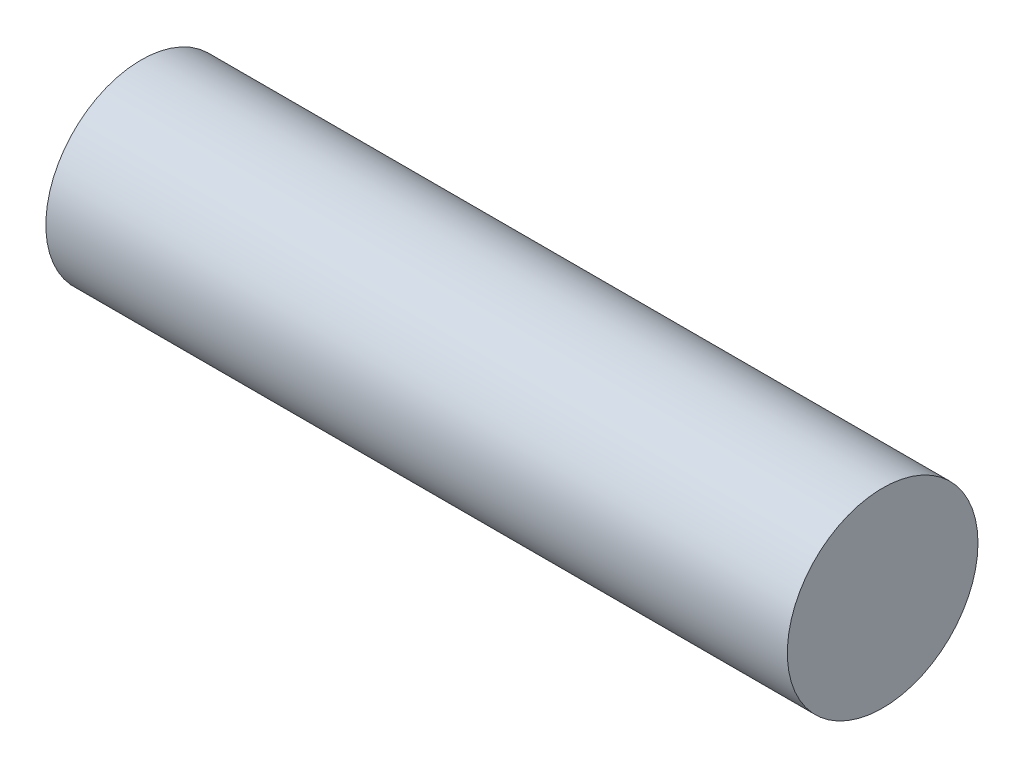
ISO-10303-21;
HEADER;
FILE_DESCRIPTION(('STEP AP214'),'2;1');
FILE_NAME('part.step','',(''),(''),'','','');
FILE_SCHEMA(('AUTOMOTIVE_DESIGN { 1 0 10303 214 1 1 1 1 }'));
ENDSEC;
DATA;
#1=APPLICATION_CONTEXT('core data for automotive mechanical design processes');
#2=APPLICATION_PROTOCOL_DEFINITION('international standard','automotive_design',2000,#1);
#3=PRODUCT_CONTEXT('',#1,'mechanical');
#4=PRODUCT('Part','Part','',(#3));
#5=PRODUCT_RELATED_PRODUCT_CATEGORY('part','',(#4));
#6=PRODUCT_DEFINITION_FORMATION('','',#4);
#7=PRODUCT_DEFINITION_CONTEXT('part definition',#1,'design');
#8=PRODUCT_DEFINITION('design','',#6,#7);
#9=PRODUCT_DEFINITION_SHAPE('','',#8);
#10=(LENGTH_UNIT() NAMED_UNIT(*) SI_UNIT(.MILLI.,.METRE.));
#11=(NAMED_UNIT(*) PLANE_ANGLE_UNIT() SI_UNIT($,.RADIAN.));
#12=(NAMED_UNIT(*) SI_UNIT($,.STERADIAN.) SOLID_ANGLE_UNIT());
#13=UNCERTAINTY_MEASURE_WITH_UNIT(LENGTH_MEASURE(1.E-05),#10,'distance_accuracy_value','');
#14=(GEOMETRIC_REPRESENTATION_CONTEXT(3) GLOBAL_UNCERTAINTY_ASSIGNED_CONTEXT((#13)) GLOBAL_UNIT_ASSIGNED_CONTEXT((#10,
#11,#12)) REPRESENTATION_CONTEXT('',''));
#15=CARTESIAN_POINT('',(0.,0.,0.));
#16=DIRECTION('',(0.,0.,1.));
#17=DIRECTION('',(1.,0.,0.));
#18=AXIS2_PLACEMENT_3D('',#15,#16,#17);
#19=CARTESIAN_POINT('',(70.,0.,0.));
#20=DIRECTION('',(-1.,0.,0.));
#21=DIRECTION('',(0.,0.,1.));
#22=AXIS2_PLACEMENT_3D('',#19,#20,#21);
#23=CYLINDRICAL_SURFACE('',#22,9.);
#24=CARTESIAN_POINT('',(70.,0.,0.));
#25=DIRECTION('',(1.,0.,0.));
#26=DIRECTION('',(0.,0.,-1.));
#27=AXIS2_PLACEMENT_3D('',#24,#25,#26);
#28=CIRCLE('',#27,9.);
#29=CARTESIAN_POINT('',(70.,0.,-9.));
#30=VERTEX_POINT('',#29);
#31=EDGE_CURVE('E10',#30,#30,#28,.T.);
#32=ORIENTED_EDGE('',*,*,#31,.F.);
#33=EDGE_LOOP('',(#32));
#34=FACE_BOUND('',#33,.T.);
#35=CARTESIAN_POINT('',(0.,0.,0.));
#36=DIRECTION('',(1.,0.,0.));
#37=DIRECTION('',(0.,0.,-1.));
#38=AXIS2_PLACEMENT_3D('',#35,#36,#37);
#39=CIRCLE('',#38,9.);
#40=CARTESIAN_POINT('',(0.,0.,-9.));
#41=VERTEX_POINT('',#40);
#42=EDGE_CURVE('E46',#41,#41,#39,.T.);
#43=ORIENTED_EDGE('',*,*,#42,.T.);
#44=EDGE_LOOP('',(#43));
#45=FACE_BOUND('',#44,.T.);
#46=ADVANCED_FACE('F43',(#34,#45),#23,.T.);
#47=CARTESIAN_POINT('',(70.,0.,0.));
#48=DIRECTION('',(1.,0.,0.));
#49=DIRECTION('',(0.,0.,-1.));
#50=AXIS2_PLACEMENT_3D('',#47,#48,#49);
#51=PLANE('',#50);
#52=ORIENTED_EDGE('',*,*,#31,.T.);
#53=EDGE_LOOP('',(#52));
#54=FACE_BOUND('',#53,.T.);
#55=ADVANCED_FACE('F60',(#54),#51,.T.);
#56=CARTESIAN_POINT('',(0.,0.,0.));
#57=DIRECTION('',(1.,0.,0.));
#58=DIRECTION('',(0.,0.,-1.));
#59=AXIS2_PLACEMENT_3D('',#56,#57,#58);
#60=PLANE('',#59);
#61=ORIENTED_EDGE('',*,*,#42,.F.);
#62=EDGE_LOOP('',(#61));
#63=FACE_BOUND('',#62,.T.);
#64=ADVANCED_FACE('F58',(#63),#60,.F.);
#65=CLOSED_SHELL('',(#46,#55,#64));
#66=MANIFOLD_SOLID_BREP('B2',#65);
#67=ADVANCED_BREP_SHAPE_REPRESENTATION('',(#18,#66),#14);
#68=SHAPE_DEFINITION_REPRESENTATION(#9,#67);
ENDSEC;
END-ISO-10303-21;
